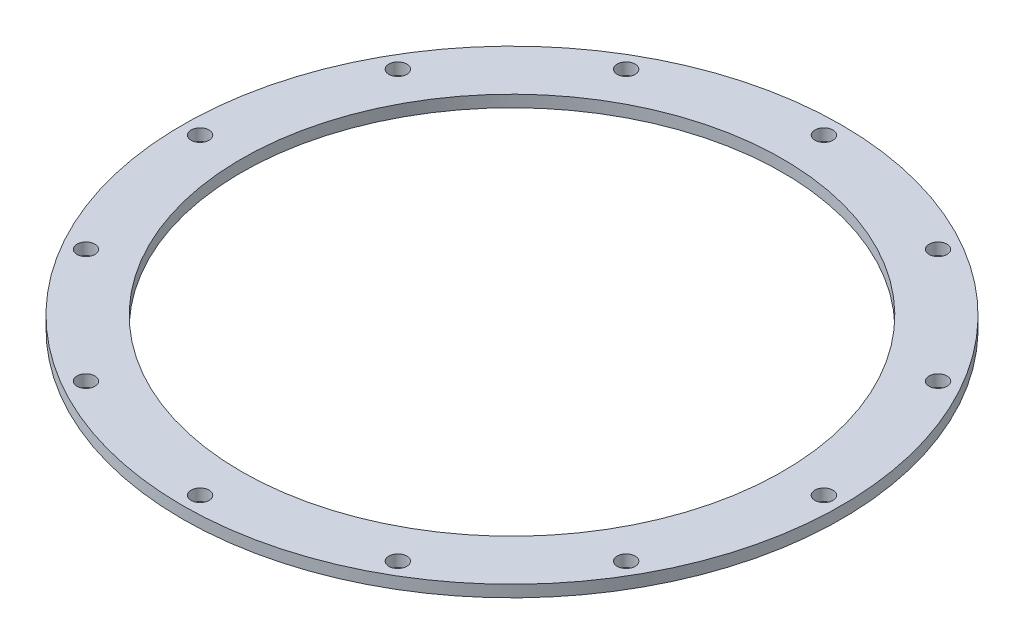
ISO-10303-21;
HEADER;
FILE_DESCRIPTION(('STEP AP214'),'2;1');
FILE_NAME('part.step','',(''),(''),'','','');
FILE_SCHEMA(('AUTOMOTIVE_DESIGN { 1 0 10303 214 1 1 1 1 }'));
ENDSEC;
DATA;
#1=APPLICATION_CONTEXT('core data for automotive mechanical design processes');
#2=APPLICATION_PROTOCOL_DEFINITION('international standard','automotive_design',2000,#1);
#3=PRODUCT_CONTEXT('',#1,'mechanical');
#4=PRODUCT('Part','Part','',(#3));
#5=PRODUCT_RELATED_PRODUCT_CATEGORY('part','',(#4));
#6=PRODUCT_DEFINITION_FORMATION('','',#4);
#7=PRODUCT_DEFINITION_CONTEXT('part definition',#1,'design');
#8=PRODUCT_DEFINITION('design','',#6,#7);
#9=PRODUCT_DEFINITION_SHAPE('','',#8);
#10=(LENGTH_UNIT() NAMED_UNIT(*) SI_UNIT(.MILLI.,.METRE.));
#11=(NAMED_UNIT(*) PLANE_ANGLE_UNIT() SI_UNIT($,.RADIAN.));
#12=(NAMED_UNIT(*) SI_UNIT($,.STERADIAN.) SOLID_ANGLE_UNIT());
#13=UNCERTAINTY_MEASURE_WITH_UNIT(LENGTH_MEASURE(1.E-05),#10,'distance_accuracy_value','');
#14=(GEOMETRIC_REPRESENTATION_CONTEXT(3) GLOBAL_UNCERTAINTY_ASSIGNED_CONTEXT((#13)) GLOBAL_UNIT_ASSIGNED_CONTEXT((#10,
#11,#12)) REPRESENTATION_CONTEXT('',''));
#15=CARTESIAN_POINT('',(0.,0.,0.));
#16=DIRECTION('',(0.,0.,1.));
#17=DIRECTION('',(1.,0.,0.));
#18=AXIS2_PLACEMENT_3D('',#15,#16,#17);
#19=CARTESIAN_POINT('',(0.,2.,0.));
#20=DIRECTION('',(0.,1.,0.));
#21=DIRECTION('',(0.,0.,1.));
#22=AXIS2_PLACEMENT_3D('',#19,#20,#21);
#23=PLANE('',#22);
#24=CARTESIAN_POINT('',(-26.5,2.,45.8993464005753));
#25=DIRECTION('',(0.,1.,0.));
#26=DIRECTION('',(0.,0.,1.));
#27=AXIS2_PLACEMENT_3D('',#24,#25,#26);
#28=CIRCLE('',#27,1.525);
#29=CARTESIAN_POINT('',(-26.5,2.,47.4243464005753));
#30=VERTEX_POINT('',#29);
#31=EDGE_CURVE('E113',#30,#30,#28,.T.);
#32=ORIENTED_EDGE('',*,*,#31,.F.);
#33=EDGE_LOOP('',(#32));
#34=FACE_BOUND('',#33,.T.);
#35=CARTESIAN_POINT('',(26.5,2.,45.8993464005752));
#36=DIRECTION('',(0.,1.,0.));
#37=DIRECTION('',(0.,0.,1.));
#38=AXIS2_PLACEMENT_3D('',#35,#36,#37);
#39=CIRCLE('',#38,1.525);
#40=CARTESIAN_POINT('',(26.5,2.,47.4243464005752));
#41=VERTEX_POINT('',#40);
#42=EDGE_CURVE('E103',#41,#41,#39,.T.);
#43=ORIENTED_EDGE('',*,*,#42,.F.);
#44=EDGE_LOOP('',(#43));
#45=FACE_BOUND('',#44,.T.);
#46=CARTESIAN_POINT('',(53.,2.,0.));
#47=DIRECTION('',(0.,1.,0.));
#48=DIRECTION('',(0.,0.,1.));
#49=AXIS2_PLACEMENT_3D('',#46,#47,#48);
#50=CIRCLE('',#49,1.525);
#51=CARTESIAN_POINT('',(53.,2.,1.52499999999999));
#52=VERTEX_POINT('',#51);
#53=EDGE_CURVE('E93',#52,#52,#50,.T.);
#54=ORIENTED_EDGE('',*,*,#53,.F.);
#55=EDGE_LOOP('',(#54));
#56=FACE_BOUND('',#55,.T.);
#57=CARTESIAN_POINT('',(26.5,2.,-45.8993464005753));
#58=DIRECTION('',(0.,1.,0.));
#59=DIRECTION('',(0.,0.,1.));
#60=AXIS2_PLACEMENT_3D('',#57,#58,#59);
#61=CIRCLE('',#60,1.52499999999999);
#62=CARTESIAN_POINT('',(26.5,2.,-44.3743464005753));
#63=VERTEX_POINT('',#62);
#64=EDGE_CURVE('E80',#63,#63,#61,.T.);
#65=ORIENTED_EDGE('',*,*,#64,.F.);
#66=EDGE_LOOP('',(#65));
#67=FACE_BOUND('',#66,.T.);
#68=CARTESIAN_POINT('',(-26.5,2.,-45.8993464005752));
#69=DIRECTION('',(0.,1.,0.));
#70=DIRECTION('',(0.,0.,1.));
#71=AXIS2_PLACEMENT_3D('',#68,#69,#70);
#72=CIRCLE('',#71,1.525);
#73=CARTESIAN_POINT('',(-26.5,2.,-44.3743464005752));
#74=VERTEX_POINT('',#73);
#75=EDGE_CURVE('E70',#74,#74,#72,.T.);
#76=ORIENTED_EDGE('',*,*,#75,.F.);
#77=EDGE_LOOP('',(#76));
#78=FACE_BOUND('',#77,.T.);
#79=CARTESIAN_POINT('',(-53.,2.,0.));
#80=DIRECTION('',(0.,1.,0.));
#81=DIRECTION('',(0.,0.,1.));
#82=AXIS2_PLACEMENT_3D('',#79,#80,#81);
#83=CIRCLE('',#82,1.525);
#84=CARTESIAN_POINT('',(-53.,2.,1.525));
#85=VERTEX_POINT('',#84);
#86=EDGE_CURVE('E54',#85,#85,#83,.T.);
#87=ORIENTED_EDGE('',*,*,#86,.F.);
#88=EDGE_LOOP('',(#87));
#89=FACE_BOUND('',#88,.T.);
#90=CARTESIAN_POINT('',(0.,2.,0.));
#91=DIRECTION('',(0.,1.,0.));
#92=DIRECTION('',(0.,0.,1.));
#93=AXIS2_PLACEMENT_3D('',#90,#91,#92);
#94=CIRCLE('',#93,56.);
#95=CARTESIAN_POINT('',(0.,2.,56.));
#96=VERTEX_POINT('',#95);
#97=EDGE_CURVE('E10',#96,#96,#94,.T.);
#98=ORIENTED_EDGE('',*,*,#97,.T.);
#99=EDGE_LOOP('',(#98));
#100=FACE_BOUND('',#99,.T.);
#101=CARTESIAN_POINT('',(0.,2.,0.));
#102=DIRECTION('',(0.,1.,0.));
#103=DIRECTION('',(0.,0.,1.));
#104=AXIS2_PLACEMENT_3D('',#101,#102,#103);
#105=CIRCLE('',#104,46.);
#106=CARTESIAN_POINT('',(0.,2.,46.));
#107=VERTEX_POINT('',#106);
#108=EDGE_CURVE('E49',#107,#107,#105,.T.);
#109=ORIENTED_EDGE('',*,*,#108,.F.);
#110=EDGE_LOOP('',(#109));
#111=FACE_BOUND('',#110,.T.);
#112=CARTESIAN_POINT('',(-45.8993464005752,2.,-26.5));
#113=DIRECTION('',(0.,1.,0.));
#114=DIRECTION('',(0.,0.,1.));
#115=AXIS2_PLACEMENT_3D('',#112,#113,#114);
#116=CIRCLE('',#115,1.525);
#117=CARTESIAN_POINT('',(-45.8993464005752,2.,-24.975));
#118=VERTEX_POINT('',#117);
#119=EDGE_CURVE('E63',#118,#118,#116,.T.);
#120=ORIENTED_EDGE('',*,*,#119,.F.);
#121=EDGE_LOOP('',(#120));
#122=FACE_BOUND('',#121,.T.);
#123=CARTESIAN_POINT('',(0.,2.,-53.));
#124=DIRECTION('',(0.,1.,0.));
#125=DIRECTION('',(0.,0.,1.));
#126=AXIS2_PLACEMENT_3D('',#123,#124,#125);
#127=CIRCLE('',#126,1.52499999999999);
#128=CARTESIAN_POINT('',(0.,2.,-51.475));
#129=VERTEX_POINT('',#128);
#130=EDGE_CURVE('E71',#129,#129,#127,.T.);
#131=ORIENTED_EDGE('',*,*,#130,.F.);
#132=EDGE_LOOP('',(#131));
#133=FACE_BOUND('',#132,.T.);
#134=CARTESIAN_POINT('',(45.8993464005752,2.,-26.5));
#135=DIRECTION('',(0.,1.,0.));
#136=DIRECTION('',(0.,0.,1.));
#137=AXIS2_PLACEMENT_3D('',#134,#135,#136);
#138=CIRCLE('',#137,1.525);
#139=CARTESIAN_POINT('',(45.8993464005752,2.,-24.975));
#140=VERTEX_POINT('',#139);
#141=EDGE_CURVE('E84',#140,#140,#138,.T.);
#142=ORIENTED_EDGE('',*,*,#141,.F.);
#143=EDGE_LOOP('',(#142));
#144=FACE_BOUND('',#143,.T.);
#145=CARTESIAN_POINT('',(45.8993464005753,2.,26.5));
#146=DIRECTION('',(0.,1.,0.));
#147=DIRECTION('',(0.,0.,1.));
#148=AXIS2_PLACEMENT_3D('',#145,#146,#147);
#149=CIRCLE('',#148,1.525);
#150=CARTESIAN_POINT('',(45.8993464005753,2.,28.025));
#151=VERTEX_POINT('',#150);
#152=EDGE_CURVE('E100',#151,#151,#149,.T.);
#153=ORIENTED_EDGE('',*,*,#152,.F.);
#154=EDGE_LOOP('',(#153));
#155=FACE_BOUND('',#154,.T.);
#156=CARTESIAN_POINT('',(0.,2.,53.));
#157=DIRECTION('',(0.,1.,0.));
#158=DIRECTION('',(0.,0.,1.));
#159=AXIS2_PLACEMENT_3D('',#156,#157,#158);
#160=CIRCLE('',#159,1.525);
#161=CARTESIAN_POINT('',(0.,2.,54.525));
#162=VERTEX_POINT('',#161);
#163=EDGE_CURVE('E108',#162,#162,#160,.T.);
#164=ORIENTED_EDGE('',*,*,#163,.F.);
#165=EDGE_LOOP('',(#164));
#166=FACE_BOUND('',#165,.T.);
#167=CARTESIAN_POINT('',(-45.8993464005752,2.,26.5));
#168=DIRECTION('',(0.,1.,0.));
#169=DIRECTION('',(0.,0.,1.));
#170=AXIS2_PLACEMENT_3D('',#167,#168,#169);
#171=CIRCLE('',#170,1.525);
#172=CARTESIAN_POINT('',(-45.8993464005752,2.,28.025));
#173=VERTEX_POINT('',#172);
#174=EDGE_CURVE('E123',#173,#173,#171,.T.);
#175=ORIENTED_EDGE('',*,*,#174,.F.);
#176=EDGE_LOOP('',(#175));
#177=FACE_BOUND('',#176,.T.);
#178=ADVANCED_FACE('F39',(#34,#45,#56,#67,#78,#89,#100,#111,#122,#133,#144,#155,#166,#177),#23,.T.);
#179=CARTESIAN_POINT('',(0.,0.,0.));
#180=DIRECTION('',(0.,1.,0.));
#181=DIRECTION('',(0.,0.,1.));
#182=AXIS2_PLACEMENT_3D('',#179,#180,#181);
#183=PLANE('',#182);
#184=CARTESIAN_POINT('',(0.,0.,0.));
#185=DIRECTION('',(0.,1.,0.));
#186=DIRECTION('',(0.,0.,1.));
#187=AXIS2_PLACEMENT_3D('',#184,#185,#186);
#188=CIRCLE('',#187,56.);
#189=CARTESIAN_POINT('',(0.,0.,56.));
#190=VERTEX_POINT('',#189);
#191=EDGE_CURVE('E43',#190,#190,#188,.T.);
#192=ORIENTED_EDGE('',*,*,#191,.F.);
#193=EDGE_LOOP('',(#192));
#194=FACE_BOUND('',#193,.T.);
#195=CARTESIAN_POINT('',(0.,0.,0.));
#196=DIRECTION('',(0.,1.,0.));
#197=DIRECTION('',(0.,0.,1.));
#198=AXIS2_PLACEMENT_3D('',#195,#196,#197);
#199=CIRCLE('',#198,46.);
#200=CARTESIAN_POINT('',(0.,0.,46.));
#201=VERTEX_POINT('',#200);
#202=EDGE_CURVE('E55',#201,#201,#199,.T.);
#203=ORIENTED_EDGE('',*,*,#202,.T.);
#204=EDGE_LOOP('',(#203));
#205=FACE_BOUND('',#204,.T.);
#206=CARTESIAN_POINT('',(-53.,0.,0.));
#207=DIRECTION('',(0.,1.,0.));
#208=DIRECTION('',(0.,0.,1.));
#209=AXIS2_PLACEMENT_3D('',#206,#207,#208);
#210=CIRCLE('',#209,1.525);
#211=CARTESIAN_POINT('',(-53.,0.,1.525));
#212=VERTEX_POINT('',#211);
#213=EDGE_CURVE('E59',#212,#212,#210,.T.);
#214=ORIENTED_EDGE('',*,*,#213,.T.);
#215=EDGE_LOOP('',(#214));
#216=FACE_BOUND('',#215,.T.);
#217=CARTESIAN_POINT('',(-45.8993464005752,0.,-26.5));
#218=DIRECTION('',(0.,1.,0.));
#219=DIRECTION('',(0.,0.,1.));
#220=AXIS2_PLACEMENT_3D('',#217,#218,#219);
#221=CIRCLE('',#220,1.525);
#222=CARTESIAN_POINT('',(-45.8993464005752,0.,-24.975));
#223=VERTEX_POINT('',#222);
#224=EDGE_CURVE('E65',#223,#223,#221,.T.);
#225=ORIENTED_EDGE('',*,*,#224,.T.);
#226=EDGE_LOOP('',(#225));
#227=FACE_BOUND('',#226,.T.);
#228=CARTESIAN_POINT('',(-26.5,0.,-45.8993464005752));
#229=DIRECTION('',(0.,1.,0.));
#230=DIRECTION('',(0.,0.,1.));
#231=AXIS2_PLACEMENT_3D('',#228,#229,#230);
#232=CIRCLE('',#231,1.525);
#233=CARTESIAN_POINT('',(-26.5,0.,-44.3743464005752));
#234=VERTEX_POINT('',#233);
#235=EDGE_CURVE('E69',#234,#234,#232,.T.);
#236=ORIENTED_EDGE('',*,*,#235,.T.);
#237=EDGE_LOOP('',(#236));
#238=FACE_BOUND('',#237,.T.);
#239=CARTESIAN_POINT('',(0.,0.,-53.));
#240=DIRECTION('',(0.,1.,0.));
#241=DIRECTION('',(0.,0.,1.));
#242=AXIS2_PLACEMENT_3D('',#239,#240,#241);
#243=CIRCLE('',#242,1.52499999999999);
#244=CARTESIAN_POINT('',(0.,0.,-51.475));
#245=VERTEX_POINT('',#244);
#246=EDGE_CURVE('E78',#245,#245,#243,.T.);
#247=ORIENTED_EDGE('',*,*,#246,.T.);
#248=EDGE_LOOP('',(#247));
#249=FACE_BOUND('',#248,.T.);
#250=CARTESIAN_POINT('',(26.5,0.,-45.8993464005753));
#251=DIRECTION('',(0.,1.,0.));
#252=DIRECTION('',(0.,0.,1.));
#253=AXIS2_PLACEMENT_3D('',#250,#251,#252);
#254=CIRCLE('',#253,1.52499999999999);
#255=CARTESIAN_POINT('',(26.5,0.,-44.3743464005753));
#256=VERTEX_POINT('',#255);
#257=EDGE_CURVE('E85',#256,#256,#254,.T.);
#258=ORIENTED_EDGE('',*,*,#257,.T.);
#259=EDGE_LOOP('',(#258));
#260=FACE_BOUND('',#259,.T.);
#261=CARTESIAN_POINT('',(45.8993464005752,0.,-26.5));
#262=DIRECTION('',(0.,1.,0.));
#263=DIRECTION('',(0.,0.,1.));
#264=AXIS2_PLACEMENT_3D('',#261,#262,#263);
#265=CIRCLE('',#264,1.525);
#266=CARTESIAN_POINT('',(45.8993464005752,0.,-24.975));
#267=VERTEX_POINT('',#266);
#268=EDGE_CURVE('E86',#267,#267,#265,.T.);
#269=ORIENTED_EDGE('',*,*,#268,.T.);
#270=EDGE_LOOP('',(#269));
#271=FACE_BOUND('',#270,.T.);
#272=CARTESIAN_POINT('',(53.,0.,0.));
#273=DIRECTION('',(0.,1.,0.));
#274=DIRECTION('',(0.,0.,1.));
#275=AXIS2_PLACEMENT_3D('',#272,#273,#274);
#276=CIRCLE('',#275,1.525);
#277=CARTESIAN_POINT('',(53.,0.,1.52499999999999));
#278=VERTEX_POINT('',#277);
#279=EDGE_CURVE('E94',#278,#278,#276,.T.);
#280=ORIENTED_EDGE('',*,*,#279,.T.);
#281=EDGE_LOOP('',(#280));
#282=FACE_BOUND('',#281,.T.);
#283=CARTESIAN_POINT('',(45.8993464005753,0.,26.5));
#284=DIRECTION('',(0.,1.,0.));
#285=DIRECTION('',(0.,0.,1.));
#286=AXIS2_PLACEMENT_3D('',#283,#284,#285);
#287=CIRCLE('',#286,1.525);
#288=CARTESIAN_POINT('',(45.8993464005753,0.,28.025));
#289=VERTEX_POINT('',#288);
#290=EDGE_CURVE('E99',#289,#289,#287,.T.);
#291=ORIENTED_EDGE('',*,*,#290,.T.);
#292=EDGE_LOOP('',(#291));
#293=FACE_BOUND('',#292,.T.);
#294=CARTESIAN_POINT('',(26.5,0.,45.8993464005752));
#295=DIRECTION('',(0.,1.,0.));
#296=DIRECTION('',(0.,0.,1.));
#297=AXIS2_PLACEMENT_3D('',#294,#295,#296);
#298=CIRCLE('',#297,1.525);
#299=CARTESIAN_POINT('',(26.5,0.,47.4243464005752));
#300=VERTEX_POINT('',#299);
#301=EDGE_CURVE('E106',#300,#300,#298,.T.);
#302=ORIENTED_EDGE('',*,*,#301,.T.);
#303=EDGE_LOOP('',(#302));
#304=FACE_BOUND('',#303,.T.);
#305=CARTESIAN_POINT('',(0.,0.,53.));
#306=DIRECTION('',(0.,1.,0.));
#307=DIRECTION('',(0.,0.,1.));
#308=AXIS2_PLACEMENT_3D('',#305,#306,#307);
#309=CIRCLE('',#308,1.525);
#310=CARTESIAN_POINT('',(0.,0.,54.525));
#311=VERTEX_POINT('',#310);
#312=EDGE_CURVE('E115',#311,#311,#309,.T.);
#313=ORIENTED_EDGE('',*,*,#312,.T.);
#314=EDGE_LOOP('',(#313));
#315=FACE_BOUND('',#314,.T.);
#316=CARTESIAN_POINT('',(-26.5,0.,45.8993464005753));
#317=DIRECTION('',(0.,1.,0.));
#318=DIRECTION('',(0.,0.,1.));
#319=AXIS2_PLACEMENT_3D('',#316,#317,#318);
#320=CIRCLE('',#319,1.525);
#321=CARTESIAN_POINT('',(-26.5,0.,47.4243464005753));
#322=VERTEX_POINT('',#321);
#323=EDGE_CURVE('E117',#322,#322,#320,.T.);
#324=ORIENTED_EDGE('',*,*,#323,.T.);
#325=EDGE_LOOP('',(#324));
#326=FACE_BOUND('',#325,.T.);
#327=CARTESIAN_POINT('',(-45.8993464005752,0.,26.5));
#328=DIRECTION('',(0.,1.,0.));
#329=DIRECTION('',(0.,0.,1.));
#330=AXIS2_PLACEMENT_3D('',#327,#328,#329);
#331=CIRCLE('',#330,1.525);
#332=CARTESIAN_POINT('',(-45.8993464005752,0.,28.025));
#333=VERTEX_POINT('',#332);
#334=EDGE_CURVE('E122',#333,#333,#331,.T.);
#335=ORIENTED_EDGE('',*,*,#334,.T.);
#336=EDGE_LOOP('',(#335));
#337=FACE_BOUND('',#336,.T.);
#338=ADVANCED_FACE('F135',(#194,#205,#216,#227,#238,#249,#260,#271,#282,#293,#304,#315,#326,
#337),#183,.F.);
#339=CARTESIAN_POINT('',(0.,2.,0.));
#340=DIRECTION('',(0.,-1.,0.));
#341=DIRECTION('',(0.,0.,-1.));
#342=AXIS2_PLACEMENT_3D('',#339,#340,#341);
#343=CYLINDRICAL_SURFACE('',#342,56.);
#344=ORIENTED_EDGE('',*,*,#97,.F.);
#345=EDGE_LOOP('',(#344));
#346=FACE_BOUND('',#345,.T.);
#347=ORIENTED_EDGE('',*,*,#191,.T.);
#348=EDGE_LOOP('',(#347));
#349=FACE_BOUND('',#348,.T.);
#350=ADVANCED_FACE('F41',(#346,#349),#343,.T.);
#351=CARTESIAN_POINT('',(0.,2.,0.));
#352=DIRECTION('',(0.,-1.,0.));
#353=DIRECTION('',(0.,0.,-1.));
#354=AXIS2_PLACEMENT_3D('',#351,#352,#353);
#355=CYLINDRICAL_SURFACE('',#354,46.);
#356=ORIENTED_EDGE('',*,*,#108,.T.);
#357=EDGE_LOOP('',(#356));
#358=FACE_BOUND('',#357,.T.);
#359=ORIENTED_EDGE('',*,*,#202,.F.);
#360=EDGE_LOOP('',(#359));
#361=FACE_BOUND('',#360,.T.);
#362=ADVANCED_FACE('F145',(#358,#361),#355,.F.);
#363=CARTESIAN_POINT('',(-53.,2.,0.));
#364=DIRECTION('',(0.,-1.,0.));
#365=DIRECTION('',(0.,0.,-1.));
#366=AXIS2_PLACEMENT_3D('',#363,#364,#365);
#367=CYLINDRICAL_SURFACE('',#366,1.525);
#368=ORIENTED_EDGE('',*,*,#86,.T.);
#369=EDGE_LOOP('',(#368));
#370=FACE_BOUND('',#369,.T.);
#371=ORIENTED_EDGE('',*,*,#213,.F.);
#372=EDGE_LOOP('',(#371));
#373=FACE_BOUND('',#372,.T.);
#374=ADVANCED_FACE('F150',(#370,#373),#367,.F.);
#375=CARTESIAN_POINT('',(-45.8993464005752,2.,-26.5));
#376=DIRECTION('',(0.,-1.,0.));
#377=DIRECTION('',(0.,0.,-1.));
#378=AXIS2_PLACEMENT_3D('',#375,#376,#377);
#379=CYLINDRICAL_SURFACE('',#378,1.525);
#380=ORIENTED_EDGE('',*,*,#119,.T.);
#381=EDGE_LOOP('',(#380));
#382=FACE_BOUND('',#381,.T.);
#383=ORIENTED_EDGE('',*,*,#224,.F.);
#384=EDGE_LOOP('',(#383));
#385=FACE_BOUND('',#384,.T.);
#386=ADVANCED_FACE('F151',(#382,#385),#379,.F.);
#387=CARTESIAN_POINT('',(-26.5,2.,-45.8993464005752));
#388=DIRECTION('',(0.,-1.,0.));
#389=DIRECTION('',(0.,0.,-1.));
#390=AXIS2_PLACEMENT_3D('',#387,#388,#389);
#391=CYLINDRICAL_SURFACE('',#390,1.525);
#392=ORIENTED_EDGE('',*,*,#75,.T.);
#393=EDGE_LOOP('',(#392));
#394=FACE_BOUND('',#393,.T.);
#395=ORIENTED_EDGE('',*,*,#235,.F.);
#396=EDGE_LOOP('',(#395));
#397=FACE_BOUND('',#396,.T.);
#398=ADVANCED_FACE('F154',(#394,#397),#391,.F.);
#399=CARTESIAN_POINT('',(0.,2.,-53.));
#400=DIRECTION('',(0.,-1.,0.));
#401=DIRECTION('',(0.,0.,-1.));
#402=AXIS2_PLACEMENT_3D('',#399,#400,#401);
#403=CYLINDRICAL_SURFACE('',#402,1.52499999999999);
#404=ORIENTED_EDGE('',*,*,#130,.T.);
#405=EDGE_LOOP('',(#404));
#406=FACE_BOUND('',#405,.T.);
#407=ORIENTED_EDGE('',*,*,#246,.F.);
#408=EDGE_LOOP('',(#407));
#409=FACE_BOUND('',#408,.T.);
#410=ADVANCED_FACE('F157',(#406,#409),#403,.F.);
#411=CARTESIAN_POINT('',(26.5,2.,-45.8993464005753));
#412=DIRECTION('',(0.,-1.,0.));
#413=DIRECTION('',(0.,0.,-1.));
#414=AXIS2_PLACEMENT_3D('',#411,#412,#413);
#415=CYLINDRICAL_SURFACE('',#414,1.52499999999999);
#416=ORIENTED_EDGE('',*,*,#64,.T.);
#417=EDGE_LOOP('',(#416));
#418=FACE_BOUND('',#417,.T.);
#419=ORIENTED_EDGE('',*,*,#257,.F.);
#420=EDGE_LOOP('',(#419));
#421=FACE_BOUND('',#420,.T.);
#422=ADVANCED_FACE('F162',(#418,#421),#415,.F.);
#423=CARTESIAN_POINT('',(45.8993464005752,2.,-26.5));
#424=DIRECTION('',(0.,-1.,0.));
#425=DIRECTION('',(0.,0.,-1.));
#426=AXIS2_PLACEMENT_3D('',#423,#424,#425);
#427=CYLINDRICAL_SURFACE('',#426,1.525);
#428=ORIENTED_EDGE('',*,*,#141,.T.);
#429=EDGE_LOOP('',(#428));
#430=FACE_BOUND('',#429,.T.);
#431=ORIENTED_EDGE('',*,*,#268,.F.);
#432=EDGE_LOOP('',(#431));
#433=FACE_BOUND('',#432,.T.);
#434=ADVANCED_FACE('F170',(#430,#433),#427,.F.);
#435=CARTESIAN_POINT('',(53.,2.,0.));
#436=DIRECTION('',(0.,-1.,0.));
#437=DIRECTION('',(0.,0.,-1.));
#438=AXIS2_PLACEMENT_3D('',#435,#436,#437);
#439=CYLINDRICAL_SURFACE('',#438,1.525);
#440=ORIENTED_EDGE('',*,*,#53,.T.);
#441=EDGE_LOOP('',(#440));
#442=FACE_BOUND('',#441,.T.);
#443=ORIENTED_EDGE('',*,*,#279,.F.);
#444=EDGE_LOOP('',(#443));
#445=FACE_BOUND('',#444,.T.);
#446=ADVANCED_FACE('F173',(#442,#445),#439,.F.);
#447=CARTESIAN_POINT('',(45.8993464005753,2.,26.5));
#448=DIRECTION('',(0.,-1.,0.));
#449=DIRECTION('',(0.,0.,-1.));
#450=AXIS2_PLACEMENT_3D('',#447,#448,#449);
#451=CYLINDRICAL_SURFACE('',#450,1.525);
#452=ORIENTED_EDGE('',*,*,#152,.T.);
#453=EDGE_LOOP('',(#452));
#454=FACE_BOUND('',#453,.T.);
#455=ORIENTED_EDGE('',*,*,#290,.F.);
#456=EDGE_LOOP('',(#455));
#457=FACE_BOUND('',#456,.T.);
#458=ADVANCED_FACE('F171',(#454,#457),#451,.F.);
#459=CARTESIAN_POINT('',(26.5,2.,45.8993464005752));
#460=DIRECTION('',(0.,-1.,0.));
#461=DIRECTION('',(0.,0.,-1.));
#462=AXIS2_PLACEMENT_3D('',#459,#460,#461);
#463=CYLINDRICAL_SURFACE('',#462,1.525);
#464=ORIENTED_EDGE('',*,*,#42,.T.);
#465=EDGE_LOOP('',(#464));
#466=FACE_BOUND('',#465,.T.);
#467=ORIENTED_EDGE('',*,*,#301,.F.);
#468=EDGE_LOOP('',(#467));
#469=FACE_BOUND('',#468,.T.);
#470=ADVANCED_FACE('F177',(#466,#469),#463,.F.);
#471=CARTESIAN_POINT('',(0.,2.,53.));
#472=DIRECTION('',(0.,-1.,0.));
#473=DIRECTION('',(0.,0.,-1.));
#474=AXIS2_PLACEMENT_3D('',#471,#472,#473);
#475=CYLINDRICAL_SURFACE('',#474,1.525);
#476=ORIENTED_EDGE('',*,*,#163,.T.);
#477=EDGE_LOOP('',(#476));
#478=FACE_BOUND('',#477,.T.);
#479=ORIENTED_EDGE('',*,*,#312,.F.);
#480=EDGE_LOOP('',(#479));
#481=FACE_BOUND('',#480,.T.);
#482=ADVANCED_FACE('F181',(#478,#481),#475,.F.);
#483=CARTESIAN_POINT('',(-26.5,2.,45.8993464005753));
#484=DIRECTION('',(0.,-1.,0.));
#485=DIRECTION('',(0.,0.,-1.));
#486=AXIS2_PLACEMENT_3D('',#483,#484,#485);
#487=CYLINDRICAL_SURFACE('',#486,1.525);
#488=ORIENTED_EDGE('',*,*,#31,.T.);
#489=EDGE_LOOP('',(#488));
#490=FACE_BOUND('',#489,.T.);
#491=ORIENTED_EDGE('',*,*,#323,.F.);
#492=EDGE_LOOP('',(#491));
#493=FACE_BOUND('',#492,.T.);
#494=ADVANCED_FACE('F189',(#490,#493),#487,.F.);
#495=CARTESIAN_POINT('',(-45.8993464005752,2.,26.5));
#496=DIRECTION('',(0.,-1.,0.));
#497=DIRECTION('',(0.,0.,-1.));
#498=AXIS2_PLACEMENT_3D('',#495,#496,#497);
#499=CYLINDRICAL_SURFACE('',#498,1.525);
#500=ORIENTED_EDGE('',*,*,#174,.T.);
#501=EDGE_LOOP('',(#500));
#502=FACE_BOUND('',#501,.T.);
#503=ORIENTED_EDGE('',*,*,#334,.F.);
#504=EDGE_LOOP('',(#503));
#505=FACE_BOUND('',#504,.T.);
#506=ADVANCED_FACE('F128',(#502,#505),#499,.F.);
#507=CLOSED_SHELL('',(#178,#338,#350,#362,#374,#386,#398,#410,#422,#434,#446,#458,#470,#482,
#494,#506));
#508=MANIFOLD_SOLID_BREP('B2',#507);
#509=ADVANCED_BREP_SHAPE_REPRESENTATION('',(#18,#508),#14);
#510=SHAPE_DEFINITION_REPRESENTATION(#9,#509);
ENDSEC;
END-ISO-10303-21;
